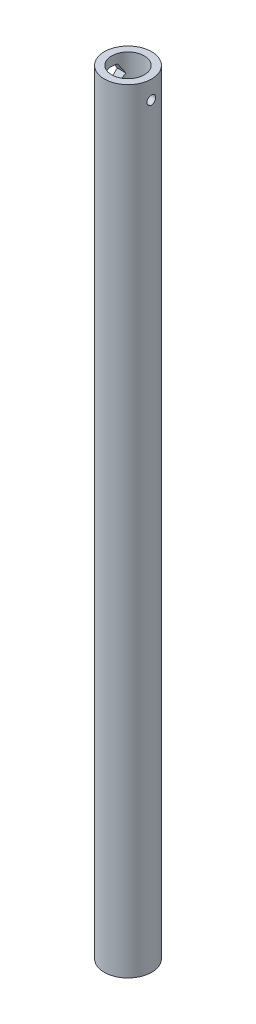
ISO-10303-21;
HEADER;
FILE_DESCRIPTION(('STEP AP214'),'2;1');
FILE_NAME('part.step','',(''),(''),'','','');
FILE_SCHEMA(('AUTOMOTIVE_DESIGN { 1 0 10303 214 1 1 1 1 }'));
ENDSEC;
DATA;
#1=APPLICATION_CONTEXT('core data for automotive mechanical design processes');
#2=APPLICATION_PROTOCOL_DEFINITION('international standard','automotive_design',2000,#1);
#3=PRODUCT_CONTEXT('',#1,'mechanical');
#4=PRODUCT('Part','Part','',(#3));
#5=PRODUCT_RELATED_PRODUCT_CATEGORY('part','',(#4));
#6=PRODUCT_DEFINITION_FORMATION('','',#4);
#7=PRODUCT_DEFINITION_CONTEXT('part definition',#1,'design');
#8=PRODUCT_DEFINITION('design','',#6,#7);
#9=PRODUCT_DEFINITION_SHAPE('','',#8);
#10=(LENGTH_UNIT() NAMED_UNIT(*) SI_UNIT(.MILLI.,.METRE.));
#11=(NAMED_UNIT(*) PLANE_ANGLE_UNIT() SI_UNIT($,.RADIAN.));
#12=(NAMED_UNIT(*) SI_UNIT($,.STERADIAN.) SOLID_ANGLE_UNIT());
#13=UNCERTAINTY_MEASURE_WITH_UNIT(LENGTH_MEASURE(1.E-05),#10,'distance_accuracy_value','');
#14=(GEOMETRIC_REPRESENTATION_CONTEXT(3) GLOBAL_UNCERTAINTY_ASSIGNED_CONTEXT((#13)) GLOBAL_UNIT_ASSIGNED_CONTEXT((#10,
#11,#12)) REPRESENTATION_CONTEXT('',''));
#15=CARTESIAN_POINT('',(0.,0.,0.));
#16=DIRECTION('',(0.,0.,1.));
#17=DIRECTION('',(1.,0.,0.));
#18=AXIS2_PLACEMENT_3D('',#15,#16,#17);
#19=CARTESIAN_POINT('',(0.,269.875,0.));
#20=DIRECTION('',(0.,-1.,0.));
#21=DIRECTION('',(0.,0.,-1.));
#22=AXIS2_PLACEMENT_3D('',#19,#20,#21);
#23=CYLINDRICAL_SURFACE('',#22,5.71500000000003);
#24=CARTESIAN_POINT('',(5.50805310431919,263.525,1.52400000000002));
#25=CARTESIAN_POINT('',(5.50805455939907,263.441045935443,1.52399797548615));
#26=CARTESIAN_POINT('',(5.50999353586478,263.357070439638,1.51703907837234));
#27=CARTESIAN_POINT('',(5.51751673600562,263.191544668774,1.48944012444324));
#28=CARTESIAN_POINT('',(5.52310278847948,263.109995631907,1.46879320379174));
#29=CARTESIAN_POINT('',(5.53724349884653,262.951741250701,1.41454514316771));
#30=CARTESIAN_POINT('',(5.54579398091339,262.875029271373,1.38096221807138));
#31=CARTESIAN_POINT('',(5.56489480049376,262.728316244074,1.30185249837543));
#32=CARTESIAN_POINT('',(5.57544529334241,262.658315718,1.25632477595184));
#33=CARTESIAN_POINT('',(5.59765306339737,262.525261679195,1.15340014080412));
#34=CARTESIAN_POINT('',(5.6093299633073,262.462400892692,1.09575826698204));
#35=CARTESIAN_POINT('',(5.63230548494624,262.347114438363,0.970768395904205));
#36=CARTESIAN_POINT('',(5.64360406735484,262.29468985244,0.903419393574115));
#37=CARTESIAN_POINT('',(5.66476887212937,262.200960276937,0.759590686205409));
#38=CARTESIAN_POINT('',(5.6746092471187,262.159846886802,0.682981986748138));
#39=CARTESIAN_POINT('',(5.69152374173421,262.09115630785,0.523633480083526));
#40=CARTESIAN_POINT('',(5.69859832777115,262.063576836531,0.440894709426776));
#41=CARTESIAN_POINT('',(5.70904537825266,262.02336072218,0.27364636289923));
#42=CARTESIAN_POINT('',(5.71249893883705,262.010396239811,0.189220772841044));
#43=CARTESIAN_POINT('',(5.71559835758728,261.998746674478,0.0193270277734894));
#44=CARTESIAN_POINT('',(5.71524485305317,262.000059201554,-0.0661409503482013));
#45=CARTESIAN_POINT('',(5.71082939005144,262.016695533155,-0.233411448678887));
#46=CARTESIAN_POINT('',(5.70686118488578,262.031665133719,-0.31525204974953));
#47=CARTESIAN_POINT('',(5.69577282425938,262.07461844899,-0.475214682465189));
#48=CARTESIAN_POINT('',(5.68865248907243,262.102602905775,-0.553336501793646));
#49=CARTESIAN_POINT('',(5.67192085654128,262.171063043865,-0.704548206202482));
#50=CARTESIAN_POINT('',(5.6622855096282,262.211660087011,-0.777580374983158));
#51=CARTESIAN_POINT('',(5.64156201004212,262.304099840466,-0.915916379058604));
#52=CARTESIAN_POINT('',(5.63047357435809,262.355944742759,-0.981218704121462));
#53=CARTESIAN_POINT('',(5.60764389979428,262.471288765746,-1.10435545153283));
#54=CARTESIAN_POINT('',(5.59589307059445,262.535096807128,-1.16189906317548));
#55=CARTESIAN_POINT('',(5.5733701462746,262.671578803294,-1.26553975063838));
#56=CARTESIAN_POINT('',(5.56259811085563,262.744253298251,-1.31163612853714));
#57=CARTESIAN_POINT('',(5.54321397539699,262.897035877588,-1.39129525539946));
#58=CARTESIAN_POINT('',(5.53461560410757,262.977187037396,-1.42477896349612));
#59=CARTESIAN_POINT('',(5.52072295710158,263.142267592584,-1.47770089284479));
#60=CARTESIAN_POINT('',(5.51542786204722,263.227195797374,-1.49714259723515));
#61=CARTESIAN_POINT('',(5.50891584760762,263.396699934798,-1.52092728904694));
#62=CARTESIAN_POINT('',(5.50758179655707,263.481210564041,-1.5257040805737));
#63=CARTESIAN_POINT('',(5.50882244820539,263.649823046875,-1.52121855615728));
#64=CARTESIAN_POINT('',(5.51139673491904,263.733924943015,-1.51195773431231));
#65=CARTESIAN_POINT('',(5.52005086708398,263.897661124702,-1.48004229164875));
#66=CARTESIAN_POINT('',(5.52606240244814,263.977350203709,-1.45764845309636));
#67=CARTESIAN_POINT('',(5.5408469494808,264.131841279095,-1.40039587884824));
#68=CARTESIAN_POINT('',(5.54962032174847,264.206642635767,-1.36553551538013));
#69=CARTESIAN_POINT('',(5.56918042222741,264.351049877566,-1.28345873997633));
#70=CARTESIAN_POINT('',(5.58000716512675,264.420505429628,-1.23598758571299));
#71=CARTESIAN_POINT('',(5.60235995553906,264.550624035898,-1.13035253726488));
#72=CARTESIAN_POINT('',(5.61388613423526,264.611285433435,-1.072186633039));
#73=CARTESIAN_POINT('',(5.63674233241833,264.723894584616,-0.944806682268662));
#74=CARTESIAN_POINT('',(5.64805705431142,264.775539823258,-0.875321908998718));
#75=CARTESIAN_POINT('',(5.66887362553087,264.866433172407,-0.728417468186827));
#76=CARTESIAN_POINT('',(5.67837557134085,264.90568194278,-0.650998223288373));
#77=CARTESIAN_POINT('',(5.69443476985231,264.970307979859,-0.490967370737296));
#78=CARTESIAN_POINT('',(5.70101393562056,264.995788792816,-0.408399883896316));
#79=CARTESIAN_POINT('',(5.71058271485885,265.032456010785,-0.239953331165237));
#80=CARTESIAN_POINT('',(5.7135731237959,265.043645583562,-0.154075003497998));
#81=CARTESIAN_POINT('',(5.7155898903953,265.051214237691,0.0157292050258069));
#82=CARTESIAN_POINT('',(5.71473502431548,265.048037075178,0.0996341757842881));
#83=CARTESIAN_POINT('',(5.70942590125867,265.027992807896,0.265670008128632));
#84=CARTESIAN_POINT('',(5.70497177942648,265.011126217137,0.347800936207344));
#85=CARTESIAN_POINT('',(5.69298818517986,264.964432779052,0.507423514079829));
#86=CARTESIAN_POINT('',(5.68548009858569,264.934695966374,0.58494321303114));
#87=CARTESIAN_POINT('',(5.66817370185197,264.86318660347,0.733937139034963));
#88=CARTESIAN_POINT('',(5.6583750705584,264.821412365302,0.805410516425709));
#89=CARTESIAN_POINT('',(5.63720994394213,264.72571519663,0.942348840730292));
#90=CARTESIAN_POINT('',(5.62580861154593,264.671498051902,1.00760278164427));
#91=CARTESIAN_POINT('',(5.60286408053465,264.553012104989,1.12823653312631));
#92=CARTESIAN_POINT('',(5.59132084537674,264.488740661445,1.18361374077916));
#93=CARTESIAN_POINT('',(5.56910717265486,264.350270082369,1.2841277357837));
#94=CARTESIAN_POINT('',(5.55846151191072,264.275883704923,1.32901253831746));
#95=CARTESIAN_POINT('',(5.53959822231415,264.120345791054,1.40557521045596));
#96=CARTESIAN_POINT('',(5.53137900643315,264.039198721234,1.43726171807102));
#97=CARTESIAN_POINT('',(5.5194403248242,263.886126021942,1.48238050679485));
#98=CARTESIAN_POINT('',(5.51520466883152,263.814863836411,1.49795117020169));
#99=CARTESIAN_POINT('',(5.5095105853548,263.670739694805,1.51876120652183));
#100=CARTESIAN_POINT('',(5.50805184120943,263.597877922095,1.52400175741778));
#101=CARTESIAN_POINT('',(5.50805310431919,263.525,1.52400000000002));
#102=B_SPLINE_CURVE_WITH_KNOTS('',3,(#24,#25,#26,#27,#28,#29,#30,#31,#32,#33,#34,#35,#36,#37,
#38,#39,#40,#41,#42,#43,#44,#45,#46,#47,#48,#49,#50,#51,#52,#53,#54,#55,#56,#57,#58,#59,#60,#61,
#62,#63,#64,#65,#66,#67,#68,#69,#70,#71,#72,#73,#74,#75,#76,#77,#78,#79,#80,#81,#82,#83,#84,#85,
#86,#87,#88,#89,#90,#91,#92,#93,#94,#95,#96,#97,#98,#99,#100,#101),.UNSPECIFIED.,.T.,.F.,(4,2,2,
2,2,2,2,2,2,2,2,2,2,2,2,2,2,2,2,2,2,2,2,2,2,2,2,2,2,2,2,2,2,2,2,2,2,2,4),(0.,0.251594209624393,
0.503314676261882,0.754681989436336,1.00606883359959,1.26313628091227,1.52023036408845,
1.7814432801656,2.04261212739844,2.29779807889166,2.55294131309836,2.80164974950219,
3.05037236843817,3.30156654066054,3.55280970966609,3.81176602872859,4.0707381321137,
4.33130717503568,4.59181156122911,4.84453184690444,5.09722523609814,5.34506310025684,
5.59293333679057,5.846251718415,6.09961775910667,6.36030661099306,6.62098158404238,
6.87966777164711,7.13829660948827,7.38899249842411,7.63967897467143,7.88863940325987,
8.13763475919729,8.39326886737645,8.64897024616427,8.91029489702232,9.17144824655312,
9.38987429359819,9.60827543123583),.UNSPECIFIED.);
#103=CARTESIAN_POINT('',(5.50805310431919,263.525,1.52400000000002));
#104=VERTEX_POINT('',#103);
#105=EDGE_CURVE('E43',#104,#104,#102,.T.);
#106=ORIENTED_EDGE('',*,*,#105,.T.);
#107=EDGE_LOOP('',(#106));
#108=FACE_BOUND('',#107,.T.);
#109=CARTESIAN_POINT('',(0.,260.35,0.));
#110=DIRECTION('',(0.,-1.,0.));
#111=DIRECTION('',(0.,0.,-1.));
#112=AXIS2_PLACEMENT_3D('',#109,#110,#111);
#113=CIRCLE('',#112,5.71500000000003);
#114=CARTESIAN_POINT('',(-5.4130413509105,260.35,1.83308710467705));
#115=VERTEX_POINT('',#114);
#116=CARTESIAN_POINT('',(-5.41304135091051,260.35,-1.83308710467705));
#117=VERTEX_POINT('',#116);
#118=EDGE_CURVE('E11',#115,#117,#113,.T.);
#119=ORIENTED_EDGE('',*,*,#118,.F.);
#120=CARTESIAN_POINT('',(0.,257.175,0.));
#121=DIRECTION('',(0.,-0.5,0.866025403784439));
#122=DIRECTION('',(0.,-0.866025403784439,-0.5));
#123=AXIS2_PLACEMENT_3D('',#120,#121,#122);
#124=ELLIPSE('',#123,11.4300000000001,5.71500000000003);
#125=CARTESIAN_POINT('',(-4.38410671250908,263.525,3.6661742093541));
#126=VERTEX_POINT('',#125);
#127=EDGE_CURVE('E53',#126,#115,#124,.T.);
#128=ORIENTED_EDGE('',*,*,#127,.F.);
#129=CARTESIAN_POINT('',(0.,269.875,0.));
#130=DIRECTION('',(0.,0.5,0.866025403784439));
#131=DIRECTION('',(0.,-0.866025403784439,0.5));
#132=AXIS2_PLACEMENT_3D('',#129,#130,#131);
#133=ELLIPSE('',#132,11.4300000000001,5.71500000000003);
#134=CARTESIAN_POINT('',(-5.4130413509105,266.7,1.83308710467705));
#135=VERTEX_POINT('',#134);
#136=EDGE_CURVE('E143',#135,#126,#133,.T.);
#137=ORIENTED_EDGE('',*,*,#136,.F.);
#138=CARTESIAN_POINT('',(0.,266.7,0.));
#139=DIRECTION('',(0.,1.,0.));
#140=DIRECTION('',(0.,0.,1.));
#141=AXIS2_PLACEMENT_3D('',#138,#139,#140);
#142=CIRCLE('',#141,5.71500000000003);
#143=CARTESIAN_POINT('',(-5.41304135091049,266.7,-1.83308710467709));
#144=VERTEX_POINT('',#143);
#145=EDGE_CURVE('E141',#144,#135,#142,.T.);
#146=ORIENTED_EDGE('',*,*,#145,.F.);
#147=CARTESIAN_POINT('',(0.,269.875,0.));
#148=DIRECTION('',(0.,0.500000000000002,-0.866025403784438));
#149=DIRECTION('',(0.,-0.866025403784438,-0.500000000000002));
#150=AXIS2_PLACEMENT_3D('',#147,#148,#149);
#151=ELLIPSE('',#150,11.43,5.71500000000003);
#152=CARTESIAN_POINT('',(-4.38410671250906,263.525,-3.66617420935412));
#153=VERTEX_POINT('',#152);
#154=EDGE_CURVE('E139',#153,#144,#151,.T.);
#155=ORIENTED_EDGE('',*,*,#154,.F.);
#156=CARTESIAN_POINT('',(0.,257.175,0.));
#157=DIRECTION('',(0.,-0.499999999999999,-0.866025403784439));
#158=DIRECTION('',(0.,-0.866025403784439,0.499999999999999));
#159=AXIS2_PLACEMENT_3D('',#156,#157,#158);
#160=ELLIPSE('',#159,11.4300000000001,5.71500000000003);
#161=EDGE_CURVE('E135',#117,#153,#160,.T.);
#162=ORIENTED_EDGE('',*,*,#161,.F.);
#163=EDGE_LOOP('',(#119,#128,#137,#146,#155,#162));
#164=FACE_BOUND('',#163,.T.);
#165=CARTESIAN_POINT('',(0.,269.875,0.));
#166=DIRECTION('',(0.,1.,0.));
#167=DIRECTION('',(0.,0.,1.));
#168=AXIS2_PLACEMENT_3D('',#165,#166,#167);
#169=CIRCLE('',#168,5.71500000000003);
#170=CARTESIAN_POINT('',(0.,269.875,5.71500000000003));
#171=VERTEX_POINT('',#170);
#172=EDGE_CURVE('E106',#171,#171,#169,.T.);
#173=ORIENTED_EDGE('',*,*,#172,.T.);
#174=EDGE_LOOP('',(#173));
#175=FACE_BOUND('',#174,.T.);
#176=CARTESIAN_POINT('',(0.,3.81,0.));
#177=DIRECTION('',(0.,-1.,0.));
#178=DIRECTION('',(0.,0.,-1.));
#179=AXIS2_PLACEMENT_3D('',#176,#177,#178);
#180=CIRCLE('',#179,5.71500000000003);
#181=CARTESIAN_POINT('',(0.,3.81,-5.71500000000003));
#182=VERTEX_POINT('',#181);
#183=EDGE_CURVE('E175',#182,#182,#180,.T.);
#184=ORIENTED_EDGE('',*,*,#183,.T.);
#185=EDGE_LOOP('',(#184));
#186=FACE_BOUND('',#185,.T.);
#187=ADVANCED_FACE('F38',(#108,#164,#175,#186),#23,.F.);
#188=CARTESIAN_POINT('',(0.,269.875,0.));
#189=DIRECTION('',(0.,-1.,0.));
#190=DIRECTION('',(0.,0.,-1.));
#191=AXIS2_PLACEMENT_3D('',#188,#189,#190);
#192=CYLINDRICAL_SURFACE('',#191,8.255);
#193=CARTESIAN_POINT('',(0.,269.875,0.));
#194=DIRECTION('',(0.,0.500000000000002,-0.866025403784438));
#195=DIRECTION('',(0.,-0.866025403784438,-0.500000000000002));
#196=AXIS2_PLACEMENT_3D('',#193,#194,#195);
#197=ELLIPSE('',#196,16.5099999999999,8.255);
#198=CARTESIAN_POINT('',(-7.3962282054211,263.525,-3.66617420935412));
#199=VERTEX_POINT('',#198);
#200=CARTESIAN_POINT('',(-8.04890158137535,266.7,-1.83308710467709));
#201=VERTEX_POINT('',#200);
#202=EDGE_CURVE('E109',#199,#201,#197,.T.);
#203=ORIENTED_EDGE('',*,*,#202,.T.);
#204=CARTESIAN_POINT('',(0.,266.7,0.));
#205=DIRECTION('',(0.,1.,0.));
#206=DIRECTION('',(0.,0.,1.));
#207=AXIS2_PLACEMENT_3D('',#204,#205,#206);
#208=CIRCLE('',#207,8.255);
#209=CARTESIAN_POINT('',(-8.04890158137536,266.7,1.83308710467705));
#210=VERTEX_POINT('',#209);
#211=EDGE_CURVE('E124',#201,#210,#208,.T.);
#212=ORIENTED_EDGE('',*,*,#211,.T.);
#213=CARTESIAN_POINT('',(0.,269.875,0.));
#214=DIRECTION('',(0.,0.5,0.866025403784439));
#215=DIRECTION('',(0.,-0.866025403784439,0.5));
#216=AXIS2_PLACEMENT_3D('',#213,#214,#215);
#217=ELLIPSE('',#216,16.51,8.255);
#218=CARTESIAN_POINT('',(-7.39622820542111,263.525,3.6661742093541));
#219=VERTEX_POINT('',#218);
#220=EDGE_CURVE('E126',#210,#219,#217,.T.);
#221=ORIENTED_EDGE('',*,*,#220,.T.);
#222=CARTESIAN_POINT('',(0.,257.175,0.));
#223=DIRECTION('',(0.,-0.5,0.866025403784439));
#224=DIRECTION('',(0.,-0.866025403784439,-0.5));
#225=AXIS2_PLACEMENT_3D('',#222,#223,#224);
#226=ELLIPSE('',#225,16.51,8.255);
#227=CARTESIAN_POINT('',(-8.04890158137536,260.35,1.83308710467705));
#228=VERTEX_POINT('',#227);
#229=EDGE_CURVE('E102',#219,#228,#226,.T.);
#230=ORIENTED_EDGE('',*,*,#229,.T.);
#231=CARTESIAN_POINT('',(0.,260.35,0.));
#232=DIRECTION('',(0.,-1.,0.));
#233=DIRECTION('',(0.,0.,-1.));
#234=AXIS2_PLACEMENT_3D('',#231,#232,#233);
#235=CIRCLE('',#234,8.255);
#236=CARTESIAN_POINT('',(-8.04890158137536,260.35,-1.83308710467705));
#237=VERTEX_POINT('',#236);
#238=EDGE_CURVE('E97',#228,#237,#235,.T.);
#239=ORIENTED_EDGE('',*,*,#238,.T.);
#240=CARTESIAN_POINT('',(0.,257.175,0.));
#241=DIRECTION('',(0.,-0.499999999999999,-0.866025403784439));
#242=DIRECTION('',(0.,-0.866025403784439,0.499999999999999));
#243=AXIS2_PLACEMENT_3D('',#240,#241,#242);
#244=ELLIPSE('',#243,16.51,8.255);
#245=EDGE_CURVE('E100',#237,#199,#244,.T.);
#246=ORIENTED_EDGE('',*,*,#245,.T.);
#247=EDGE_LOOP('',(#203,#212,#221,#230,#239,#246));
#248=FACE_BOUND('',#247,.T.);
#249=CARTESIAN_POINT('',(0.,269.875,0.));
#250=DIRECTION('',(0.,1.,0.));
#251=DIRECTION('',(0.,0.,1.));
#252=AXIS2_PLACEMENT_3D('',#249,#250,#251);
#253=CIRCLE('',#252,8.255);
#254=CARTESIAN_POINT('',(0.,269.875,8.255));
#255=VERTEX_POINT('',#254);
#256=EDGE_CURVE('E132',#255,#255,#253,.T.);
#257=ORIENTED_EDGE('',*,*,#256,.F.);
#258=EDGE_LOOP('',(#257));
#259=FACE_BOUND('',#258,.T.);
#260=CARTESIAN_POINT('',(0.,0.,0.));
#261=DIRECTION('',(0.,1.,0.));
#262=DIRECTION('',(0.,0.,1.));
#263=AXIS2_PLACEMENT_3D('',#260,#261,#262);
#264=CIRCLE('',#263,8.255);
#265=CARTESIAN_POINT('',(0.,0.,8.255));
#266=VERTEX_POINT('',#265);
#267=EDGE_CURVE('E131',#266,#266,#264,.T.);
#268=ORIENTED_EDGE('',*,*,#267,.T.);
#269=EDGE_LOOP('',(#268));
#270=FACE_BOUND('',#269,.T.);
#271=CARTESIAN_POINT('',(8.255,262.001,0.));
#272=CARTESIAN_POINT('',(8.25499847254016,262.001003266589,-0.0848313001905121));
#273=CARTESIAN_POINT('',(8.25367884666485,262.008106955346,-0.169705377725456));
#274=CARTESIAN_POINT('',(8.24854177280994,262.036316667228,-0.337063461038611));
#275=CARTESIAN_POINT('',(8.2447221893501,262.057434661678,-0.419545360440563));
#276=CARTESIAN_POINT('',(8.23501263591366,262.113005663899,-0.579674380124087));
#277=CARTESIAN_POINT('',(8.22912451076999,262.147446792164,-0.657325736137134));
#278=CARTESIAN_POINT('',(8.21592149214922,262.228653052822,-0.805740209312643));
#279=CARTESIAN_POINT('',(8.20860672102942,262.275417128447,-0.876503916419555));
#280=CARTESIAN_POINT('',(8.19326320373792,262.38051913628,-1.00996463514125));
#281=CARTESIAN_POINT('',(8.1852278164436,262.438972509706,-1.07256998133355));
#282=CARTESIAN_POINT('',(8.1693982160741,262.565545479155,-1.18714401433005));
#283=CARTESIAN_POINT('',(8.16160402003707,262.633665756175,-1.23911195113965));
#284=CARTESIAN_POINT('',(8.14707478175871,262.778284054841,-1.33131524842635));
#285=CARTESIAN_POINT('',(8.14034830535066,262.854842224298,-1.37145773716785));
#286=CARTESIAN_POINT('',(8.12880948406571,263.013760650441,-1.43827620623212));
#287=CARTESIAN_POINT('',(8.12399697939016,263.096120422073,-1.46495331083797));
#288=CARTESIAN_POINT('',(8.11689773624695,263.263324623493,-1.50379032851489));
#289=CARTESIAN_POINT('',(8.11458324528432,263.348130772798,-1.51610987687784));
#290=CARTESIAN_POINT('',(8.11265837521339,263.51863553049,-1.52637749575108));
#291=CARTESIAN_POINT('',(8.11304776109703,263.60433406067,-1.52432681525292));
#292=CARTESIAN_POINT('',(8.11646137110191,263.773036858466,-1.50604171579136));
#293=CARTESIAN_POINT('',(8.11945193283538,263.856061547505,-1.48998849923616));
#294=CARTESIAN_POINT('',(8.12767808598096,264.01821864526,-1.4444392412085));
#295=CARTESIAN_POINT('',(8.13291377014578,264.097350893017,-1.41494264434668));
#296=CARTESIAN_POINT('',(8.14507559877351,264.250008801211,-1.34316577824052));
#297=CARTESIAN_POINT('',(8.15201141296639,264.323499116471,-1.30081204151644));
#298=CARTESIAN_POINT('',(8.16678557160626,264.462398064017,-1.20457514992982));
#299=CARTESIAN_POINT('',(8.17462400490722,264.527805899347,-1.1506908595487));
#300=CARTESIAN_POINT('',(8.19046706573165,264.649730426197,-1.03194397491992));
#301=CARTESIAN_POINT('',(8.19847240344659,264.706096115866,-0.966926321111151));
#302=CARTESIAN_POINT('',(8.21363719597441,264.80714270756,-0.82827798446872));
#303=CARTESIAN_POINT('',(8.22079664278991,264.851823499116,-0.754647220216367));
#304=CARTESIAN_POINT('',(8.23347676972174,264.928252974293,-0.6007075146136));
#305=CARTESIAN_POINT('',(8.23899550116639,264.959986296768,-0.520390776060032));
#306=CARTESIAN_POINT('',(8.24775725365394,265.009469199774,-0.355442315388205));
#307=CARTESIAN_POINT('',(8.25100050894517,265.027220219732,-0.270811038391474));
#308=CARTESIAN_POINT('',(8.2548138044221,265.04802524854,-0.100935336701308));
#309=CARTESIAN_POINT('',(8.25542148388929,265.051286210002,-0.0157170751258319));
#310=CARTESIAN_POINT('',(8.25399900217607,265.043573193273,0.154047167092647));
#311=CARTESIAN_POINT('',(8.25196896648205,265.032599892262,0.238593179524643));
#312=CARTESIAN_POINT('',(8.24552256882121,264.996901917871,0.403959040639871));
#313=CARTESIAN_POINT('',(8.241124329257,264.972281634829,0.484802192310297));
#314=CARTESIAN_POINT('',(8.23043264254719,264.910101297176,0.641213316755874));
#315=CARTESIAN_POINT('',(8.22413906981578,264.872540385089,0.71678093956282));
#316=CARTESIAN_POINT('',(8.21026095749427,264.785084651501,0.861381431704979));
#317=CARTESIAN_POINT('',(8.20266340602598,264.735062964265,0.930336297319007));
#318=CARTESIAN_POINT('',(8.18705441563078,264.624277692714,1.05894742559325));
#319=CARTESIAN_POINT('',(8.17904293936318,264.563513138069,1.11860284738162));
#320=CARTESIAN_POINT('',(8.16338462752007,264.432031322365,1.22770529847428));
#321=CARTESIAN_POINT('',(8.15574380080996,264.361196197366,1.27701129212545));
#322=CARTESIAN_POINT('',(8.14181154579594,264.212127231639,1.36302464147661));
#323=CARTESIAN_POINT('',(8.13552006830826,264.133893660735,1.39973245640929));
#324=CARTESIAN_POINT('',(8.12504571887919,263.972611869913,1.45930588556769));
#325=CARTESIAN_POINT('',(8.12085289356289,263.88958850039,1.48223694528547));
#326=CARTESIAN_POINT('',(8.11502750172667,263.720782975006,1.51380841651174));
#327=CARTESIAN_POINT('',(8.11339465616245,263.635001120866,1.52245038557312));
#328=CARTESIAN_POINT('',(8.11288795027191,263.464525702251,1.52514748992981));
#329=CARTESIAN_POINT('',(8.11397202546013,263.379835701136,1.51942501921467));
#330=CARTESIAN_POINT('',(8.11868389703791,263.212646778047,1.49404170835189));
#331=CARTESIAN_POINT('',(8.12231167932079,263.130147843923,1.47438094550211));
#332=CARTESIAN_POINT('',(8.13168473846357,262.969797660746,1.42177175662573));
#333=CARTESIAN_POINT('',(8.13742628955469,262.891938512394,1.38884670092226));
#334=CARTESIAN_POINT('',(8.15038272073773,262.742813683154,1.31066763543119));
#335=CARTESIAN_POINT('',(8.15759770050017,262.671548448788,1.26541279152227));
#336=CARTESIAN_POINT('',(8.17281902621316,262.53651897444,1.1630826011836));
#337=CARTESIAN_POINT('',(8.18083534299059,262.4728786956,1.10584513819441));
#338=CARTESIAN_POINT('',(8.196680810507,262.356031625453,0.981513153581953));
#339=CARTESIAN_POINT('',(8.20450991781378,262.30282723502,0.914416369925657));
#340=CARTESIAN_POINT('',(8.21917850695197,262.20793158955,0.771572605921965));
#341=CARTESIAN_POINT('',(8.22600879964707,262.166344380094,0.695755535102469));
#342=CARTESIAN_POINT('',(8.23782053138383,262.096563907552,0.538109857800525));
#343=CARTESIAN_POINT('',(8.24280372137738,262.068357952635,0.456287033066485));
#344=CARTESIAN_POINT('',(8.24933335631996,262.031925525117,0.311843250291408));
#345=CARTESIAN_POINT('',(8.25144644137951,262.02034808874,0.250071291005231));
#346=CARTESIAN_POINT('',(8.25428031165676,262.00488421013,0.125540681934362));
#347=CARTESIAN_POINT('',(8.25500113044441,262.000997582459,0.0627820559766981));
#348=CARTESIAN_POINT('',(8.255,262.001,0.));
#349=B_SPLINE_CURVE_WITH_KNOTS('',3,(#271,#272,#273,#274,#275,#276,#277,#278,#279,#280,#281,
#282,#283,#284,#285,#286,#287,#288,#289,#290,#291,#292,#293,#294,#295,#296,#297,#298,#299,#300,
#301,#302,#303,#304,#305,#306,#307,#308,#309,#310,#311,#312,#313,#314,#315,#316,#317,#318,#319,
#320,#321,#322,#323,#324,#325,#326,#327,#328,#329,#330,#331,#332,#333,#334,#335,#336,#337,#338,
#339,#340,#341,#342,#343,#344,#345,#346,#347,#348),.UNSPECIFIED.,.T.,.F.,(4,2,2,2,2,2,2,2,2,2,2,
2,2,2,2,2,2,2,2,2,2,2,2,2,2,2,2,2,2,2,2,2,2,2,2,2,2,2,4),(0.,0.254264319076723,
0.508746116369161,0.763001527351232,1.0172351415183,1.27411592970904,1.53101482314396,
1.78988055634723,2.04872467215592,2.30466249750011,2.56057807822875,2.81323026109811,
3.06589288278978,3.32002733383828,3.57418682334682,3.83222692568283,4.09026946743789,
4.34861727213486,4.60693847737757,4.86155812917206,5.11616566816149,5.36885198184865,
5.62155504235141,5.87694434832712,6.13235673366847,6.39105132820367,6.64973649172227,
6.90718286819494,7.16460118040541,7.41805873277543,7.67151487955199,7.92452640209557,
8.17755504534929,8.434258241542,8.6910204256108,8.950013432219,9.20876029598118,
9.39694109236981,9.58511735133675),.UNSPECIFIED.);
#350=CARTESIAN_POINT('',(8.255,262.001,0.));
#351=VERTEX_POINT('',#350);
#352=EDGE_CURVE('E115',#351,#351,#349,.T.);
#353=ORIENTED_EDGE('',*,*,#352,.F.);
#354=EDGE_LOOP('',(#353));
#355=FACE_BOUND('',#354,.T.);
#356=ADVANCED_FACE('F40',(#248,#259,#270,#355),#192,.T.);
#357=CARTESIAN_POINT('',(0.,269.875,0.));
#358=DIRECTION('',(0.,1.,0.));
#359=DIRECTION('',(0.,0.,1.));
#360=AXIS2_PLACEMENT_3D('',#357,#358,#359);
#361=PLANE('',#360);
#362=ORIENTED_EDGE('',*,*,#256,.T.);
#363=EDGE_LOOP('',(#362));
#364=FACE_BOUND('',#363,.T.);
#365=ORIENTED_EDGE('',*,*,#172,.F.);
#366=EDGE_LOOP('',(#365));
#367=FACE_BOUND('',#366,.T.);
#368=ADVANCED_FACE('F202',(#364,#367),#361,.T.);
#369=CARTESIAN_POINT('',(0.,0.,0.));
#370=DIRECTION('',(0.,1.,0.));
#371=DIRECTION('',(0.,0.,1.));
#372=AXIS2_PLACEMENT_3D('',#369,#370,#371);
#373=PLANE('',#372);
#374=ORIENTED_EDGE('',*,*,#267,.F.);
#375=EDGE_LOOP('',(#374));
#376=FACE_BOUND('',#375,.T.);
#377=CARTESIAN_POINT('',(0.,0.,0.));
#378=DIRECTION('',(0.,-1.,0.));
#379=DIRECTION('',(0.,0.,-1.));
#380=AXIS2_PLACEMENT_3D('',#377,#378,#379);
#381=CIRCLE('',#380,5.08);
#382=CARTESIAN_POINT('',(0.,0.,-5.08));
#383=VERTEX_POINT('',#382);
#384=EDGE_CURVE('E213',#383,#383,#381,.T.);
#385=ORIENTED_EDGE('',*,*,#384,.F.);
#386=EDGE_LOOP('',(#385));
#387=FACE_BOUND('',#386,.T.);
#388=ADVANCED_FACE('F197',(#376,#387),#373,.F.);
#389=CARTESIAN_POINT('',(-8.255,260.35,1.83308710467705));
#390=DIRECTION('',(0.,-1.,0.));
#391=DIRECTION('',(0.,0.,-1.));
#392=AXIS2_PLACEMENT_3D('',#389,#390,#391);
#393=PLANE('',#392);
#394=DIRECTION('',(1.,0.,0.));
#395=VECTOR('',#394,1.);
#396=CARTESIAN_POINT('',(-8.255,260.35,1.83308710467705));
#397=LINE('',#396,#395);
#398=EDGE_CURVE('E110',#228,#115,#397,.T.);
#399=ORIENTED_EDGE('',*,*,#398,.T.);
#400=ORIENTED_EDGE('',*,*,#118,.T.);
#401=DIRECTION('',(1.,0.,0.));
#402=VECTOR('',#401,1.);
#403=CARTESIAN_POINT('',(-8.255,260.35,-1.83308710467705));
#404=LINE('',#403,#402);
#405=EDGE_CURVE('E65',#237,#117,#404,.T.);
#406=ORIENTED_EDGE('',*,*,#405,.F.);
#407=ORIENTED_EDGE('',*,*,#238,.F.);
#408=EDGE_LOOP('',(#399,#400,#406,#407));
#409=FACE_BOUND('',#408,.T.);
#410=ADVANCED_FACE('F112',(#409),#393,.F.);
#411=CARTESIAN_POINT('',(-8.255,263.525,3.6661742093541));
#412=DIRECTION('',(0.,-0.5,0.866025403784439));
#413=DIRECTION('',(0.,-0.866025403784439,-0.5));
#414=AXIS2_PLACEMENT_3D('',#411,#412,#413);
#415=PLANE('',#414);
#416=DIRECTION('',(1.,0.,0.));
#417=VECTOR('',#416,1.);
#418=CARTESIAN_POINT('',(-8.255,263.525,3.6661742093541));
#419=LINE('',#418,#417);
#420=EDGE_CURVE('E150',#219,#126,#419,.T.);
#421=ORIENTED_EDGE('',*,*,#420,.T.);
#422=ORIENTED_EDGE('',*,*,#127,.T.);
#423=ORIENTED_EDGE('',*,*,#398,.F.);
#424=ORIENTED_EDGE('',*,*,#229,.F.);
#425=EDGE_LOOP('',(#421,#422,#423,#424));
#426=FACE_BOUND('',#425,.T.);
#427=ADVANCED_FACE('F148',(#426),#415,.F.);
#428=CARTESIAN_POINT('',(-8.255,266.7,1.83308710467705));
#429=DIRECTION('',(0.,0.5,0.866025403784439));
#430=DIRECTION('',(0.,-0.866025403784439,0.5));
#431=AXIS2_PLACEMENT_3D('',#428,#429,#430);
#432=PLANE('',#431);
#433=DIRECTION('',(1.,0.,0.));
#434=VECTOR('',#433,1.);
#435=CARTESIAN_POINT('',(-8.255,266.7,1.83308710467705));
#436=LINE('',#435,#434);
#437=EDGE_CURVE('E167',#210,#135,#436,.T.);
#438=ORIENTED_EDGE('',*,*,#437,.T.);
#439=ORIENTED_EDGE('',*,*,#136,.T.);
#440=ORIENTED_EDGE('',*,*,#420,.F.);
#441=ORIENTED_EDGE('',*,*,#220,.F.);
#442=EDGE_LOOP('',(#438,#439,#440,#441));
#443=FACE_BOUND('',#442,.T.);
#444=ADVANCED_FACE('F166',(#443),#432,.F.);
#445=CARTESIAN_POINT('',(-8.255,266.7,-1.83308710467709));
#446=DIRECTION('',(0.,1.,0.));
#447=DIRECTION('',(0.,0.,1.));
#448=AXIS2_PLACEMENT_3D('',#445,#446,#447);
#449=PLANE('',#448);
#450=DIRECTION('',(1.,0.,0.));
#451=VECTOR('',#450,1.);
#452=CARTESIAN_POINT('',(-8.255,266.7,-1.83308710467709));
#453=LINE('',#452,#451);
#454=EDGE_CURVE('E117',#201,#144,#453,.T.);
#455=ORIENTED_EDGE('',*,*,#454,.T.);
#456=ORIENTED_EDGE('',*,*,#145,.T.);
#457=ORIENTED_EDGE('',*,*,#437,.F.);
#458=ORIENTED_EDGE('',*,*,#211,.F.);
#459=EDGE_LOOP('',(#455,#456,#457,#458));
#460=FACE_BOUND('',#459,.T.);
#461=ADVANCED_FACE('F168',(#460),#449,.F.);
#462=CARTESIAN_POINT('',(-8.255,263.525,-3.66617420935412));
#463=DIRECTION('',(0.,0.500000000000002,-0.866025403784438));
#464=DIRECTION('',(0.,0.866025403784438,0.500000000000002));
#465=AXIS2_PLACEMENT_3D('',#462,#463,#464);
#466=PLANE('',#465);
#467=DIRECTION('',(1.,0.,0.));
#468=VECTOR('',#467,1.);
#469=CARTESIAN_POINT('',(-8.255,263.525,-3.66617420935412));
#470=LINE('',#469,#468);
#471=EDGE_CURVE('E60',#199,#153,#470,.T.);
#472=ORIENTED_EDGE('',*,*,#471,.T.);
#473=ORIENTED_EDGE('',*,*,#154,.T.);
#474=ORIENTED_EDGE('',*,*,#454,.F.);
#475=ORIENTED_EDGE('',*,*,#202,.F.);
#476=EDGE_LOOP('',(#472,#473,#474,#475));
#477=FACE_BOUND('',#476,.T.);
#478=ADVANCED_FACE('F158',(#477),#466,.F.);
#479=CARTESIAN_POINT('',(-8.255,260.35,-1.83308710467705));
#480=DIRECTION('',(0.,-0.499999999999999,-0.866025403784439));
#481=DIRECTION('',(0.,0.866025403784439,-0.499999999999999));
#482=AXIS2_PLACEMENT_3D('',#479,#480,#481);
#483=PLANE('',#482);
#484=ORIENTED_EDGE('',*,*,#405,.T.);
#485=ORIENTED_EDGE('',*,*,#161,.T.);
#486=ORIENTED_EDGE('',*,*,#471,.F.);
#487=ORIENTED_EDGE('',*,*,#245,.F.);
#488=EDGE_LOOP('',(#484,#485,#486,#487));
#489=FACE_BOUND('',#488,.T.);
#490=ADVANCED_FACE('F108',(#489),#483,.F.);
#491=CARTESIAN_POINT('',(8.255,263.525,0.));
#492=DIRECTION('',(-1.,0.,0.));
#493=DIRECTION('',(0.,0.,1.));
#494=AXIS2_PLACEMENT_3D('',#491,#492,#493);
#495=CYLINDRICAL_SURFACE('',#494,1.52400000000002);
#496=ORIENTED_EDGE('',*,*,#105,.F.);
#497=EDGE_LOOP('',(#496));
#498=FACE_BOUND('',#497,.T.);
#499=ORIENTED_EDGE('',*,*,#352,.T.);
#500=EDGE_LOOP('',(#499));
#501=FACE_BOUND('',#500,.T.);
#502=ADVANCED_FACE('F177',(#498,#501),#495,.F.);
#503=CARTESIAN_POINT('',(0.,3.81,0.));
#504=DIRECTION('',(0.,-1.,0.));
#505=DIRECTION('',(0.,0.,-1.));
#506=AXIS2_PLACEMENT_3D('',#503,#504,#505);
#507=PLANE('',#506);
#508=CARTESIAN_POINT('',(0.,3.81,0.));
#509=DIRECTION('',(0.,-1.,0.));
#510=DIRECTION('',(0.,0.,-1.));
#511=AXIS2_PLACEMENT_3D('',#508,#509,#510);
#512=CIRCLE('',#511,5.08);
#513=CARTESIAN_POINT('',(0.,3.81,-5.08));
#514=VERTEX_POINT('',#513);
#515=EDGE_CURVE('E215',#514,#514,#512,.T.);
#516=ORIENTED_EDGE('',*,*,#515,.T.);
#517=EDGE_LOOP('',(#516));
#518=FACE_BOUND('',#517,.T.);
#519=ORIENTED_EDGE('',*,*,#183,.F.);
#520=EDGE_LOOP('',(#519));
#521=FACE_BOUND('',#520,.T.);
#522=ADVANCED_FACE('F182',(#518,#521),#507,.F.);
#523=CARTESIAN_POINT('',(0.,3.81,0.));
#524=DIRECTION('',(0.,-1.,0.));
#525=DIRECTION('',(0.,0.,-1.));
#526=AXIS2_PLACEMENT_3D('',#523,#524,#525);
#527=CYLINDRICAL_SURFACE('',#526,5.08);
#528=CARTESIAN_POINT('',(0.,3.81,-5.08));
#529=CARTESIAN_POINT('',(0.,3.7703125,-5.08));
#530=CARTESIAN_POINT('',(0.,3.730625,-5.08));
#531=CARTESIAN_POINT('',(0.,3.65125,-5.08));
#532=CARTESIAN_POINT('',(0.,3.6115625,-5.08));
#533=CARTESIAN_POINT('',(0.,3.5321875,-5.08));
#534=CARTESIAN_POINT('',(0.,3.4925,-5.08));
#535=CARTESIAN_POINT('',(0.,3.413125,-5.08));
#536=CARTESIAN_POINT('',(0.,3.3734375,-5.08));
#537=CARTESIAN_POINT('',(0.,3.2940625,-5.08));
#538=CARTESIAN_POINT('',(0.,3.254375,-5.08));
#539=CARTESIAN_POINT('',(0.,3.175,-5.08));
#540=CARTESIAN_POINT('',(0.,3.1353125,-5.08));
#541=CARTESIAN_POINT('',(0.,3.0559375,-5.08));
#542=CARTESIAN_POINT('',(0.,3.01625,-5.08));
#543=CARTESIAN_POINT('',(0.,2.936875,-5.08));
#544=CARTESIAN_POINT('',(0.,2.8971875,-5.08));
#545=CARTESIAN_POINT('',(0.,2.8178125,-5.08));
#546=CARTESIAN_POINT('',(0.,2.778125,-5.08));
#547=CARTESIAN_POINT('',(0.,2.69875,-5.08));
#548=CARTESIAN_POINT('',(0.,2.6590625,-5.08));
#549=CARTESIAN_POINT('',(0.,2.5796875,-5.08));
#550=CARTESIAN_POINT('',(0.,2.54,-5.08));
#551=CARTESIAN_POINT('',(0.,2.460625,-5.08));
#552=CARTESIAN_POINT('',(0.,2.4209375,-5.08));
#553=CARTESIAN_POINT('',(0.,2.3415625,-5.08));
#554=CARTESIAN_POINT('',(0.,2.301875,-5.08));
#555=CARTESIAN_POINT('',(0.,2.2225,-5.08));
#556=CARTESIAN_POINT('',(0.,2.1828125,-5.08));
#557=CARTESIAN_POINT('',(0.,2.1034375,-5.08));
#558=CARTESIAN_POINT('',(0.,2.06375,-5.08));
#559=CARTESIAN_POINT('',(0.,1.984375,-5.08));
#560=CARTESIAN_POINT('',(0.,1.9446875,-5.08));
#561=CARTESIAN_POINT('',(0.,1.8653125,-5.08));
#562=CARTESIAN_POINT('',(0.,1.825625,-5.08));
#563=CARTESIAN_POINT('',(0.,1.74625,-5.08));
#564=CARTESIAN_POINT('',(0.,1.7065625,-5.08));
#565=CARTESIAN_POINT('',(0.,1.6271875,-5.08));
#566=CARTESIAN_POINT('',(0.,1.5875,-5.08));
#567=CARTESIAN_POINT('',(0.,1.508125,-5.08));
#568=CARTESIAN_POINT('',(0.,1.4684375,-5.08));
#569=CARTESIAN_POINT('',(0.,1.3890625,-5.08));
#570=CARTESIAN_POINT('',(0.,1.349375,-5.08));
#571=CARTESIAN_POINT('',(0.,1.27,-5.08));
#572=CARTESIAN_POINT('',(0.,1.2303125,-5.08));
#573=CARTESIAN_POINT('',(0.,1.1509375,-5.08));
#574=CARTESIAN_POINT('',(0.,1.11125,-5.08));
#575=CARTESIAN_POINT('',(0.,1.031875,-5.08));
#576=CARTESIAN_POINT('',(0.,0.9921875,-5.08));
#577=CARTESIAN_POINT('',(0.,0.9128125,-5.08));
#578=CARTESIAN_POINT('',(0.,0.873125,-5.08));
#579=CARTESIAN_POINT('',(0.,0.79375,-5.08));
#580=CARTESIAN_POINT('',(0.,0.7540625,-5.08));
#581=CARTESIAN_POINT('',(0.,0.6746875,-5.08));
#582=CARTESIAN_POINT('',(0.,0.635,-5.08));
#583=CARTESIAN_POINT('',(0.,0.555625,-5.08));
#584=CARTESIAN_POINT('',(0.,0.5159375,-5.08));
#585=CARTESIAN_POINT('',(0.,0.4365625,-5.08));
#586=CARTESIAN_POINT('',(0.,0.396875,-5.08));
#587=CARTESIAN_POINT('',(0.,0.3175,-5.08));
#588=CARTESIAN_POINT('',(0.,0.2778125,-5.08));
#589=CARTESIAN_POINT('',(0.,0.1984375,-5.08));
#590=CARTESIAN_POINT('',(0.,0.15875,-5.08));
#591=CARTESIAN_POINT('',(0.,0.0793749999999999,-5.08));
#592=CARTESIAN_POINT('',(0.,0.0396874999999999,-5.08));
#593=CARTESIAN_POINT('',(0.,0.,-5.08));
#594=B_SPLINE_CURVE_WITH_KNOTS('',3,(#528,#529,#530,#531,#532,#533,#534,#535,#536,#537,#538,
#539,#540,#541,#542,#543,#544,#545,#546,#547,#548,#549,#550,#551,#552,#553,#554,#555,#556,#557,
#558,#559,#560,#561,#562,#563,#564,#565,#566,#567,#568,#569,#570,#571,#572,#573,#574,#575,#576,
#577,#578,#579,#580,#581,#582,#583,#584,#585,#586,#587,#588,#589,#590,#591,#592,#593),
.UNSPECIFIED.,.F.,.F.,(4,2,2,2,2,2,2,2,2,2,2,2,2,2,2,2,2,2,2,2,2,2,2,2,2,2,2,2,2,2,2,2,4),(0.,
0.1190625,0.238125,0.3571875,0.47625,0.5953125,0.714375,0.8334375,0.9525,1.0715625,1.190625,
1.3096875,1.42875,1.5478125,1.666875,1.7859375,1.905,2.0240625,2.143125,2.2621875,2.38125,
2.5003125,2.619375,2.7384375,2.8575,2.9765625,3.095625,3.2146875,3.33375,3.4528125,3.571875,
3.6909375,3.81),.UNSPECIFIED.);
#595=EDGE_CURVE('BSEAM286',#514,#383,#594,.T.);
#596=ORIENTED_EDGE('',*,*,#515,.F.);
#597=ORIENTED_EDGE('',*,*,#384,.T.);
#598=ORIENTED_EDGE('',*,*,#595,.T.);
#599=ORIENTED_EDGE('',*,*,#595,.F.);
#600=EDGE_LOOP('',(#596,#598,#597,#599));
#601=FACE_BOUND('',#600,.T.);
#602=ADVANCED_FACE('F286',(#601),#527,.F.);
#603=CLOSED_SHELL('',(#187,#356,#368,#388,#410,#427,#444,#461,#478,#490,#502,#522,#602));
#604=MANIFOLD_SOLID_BREP('B2',#603);
#605=ADVANCED_BREP_SHAPE_REPRESENTATION('',(#18,#604),#14);
#606=SHAPE_DEFINITION_REPRESENTATION(#9,#605);
ENDSEC;
END-ISO-10303-21;
